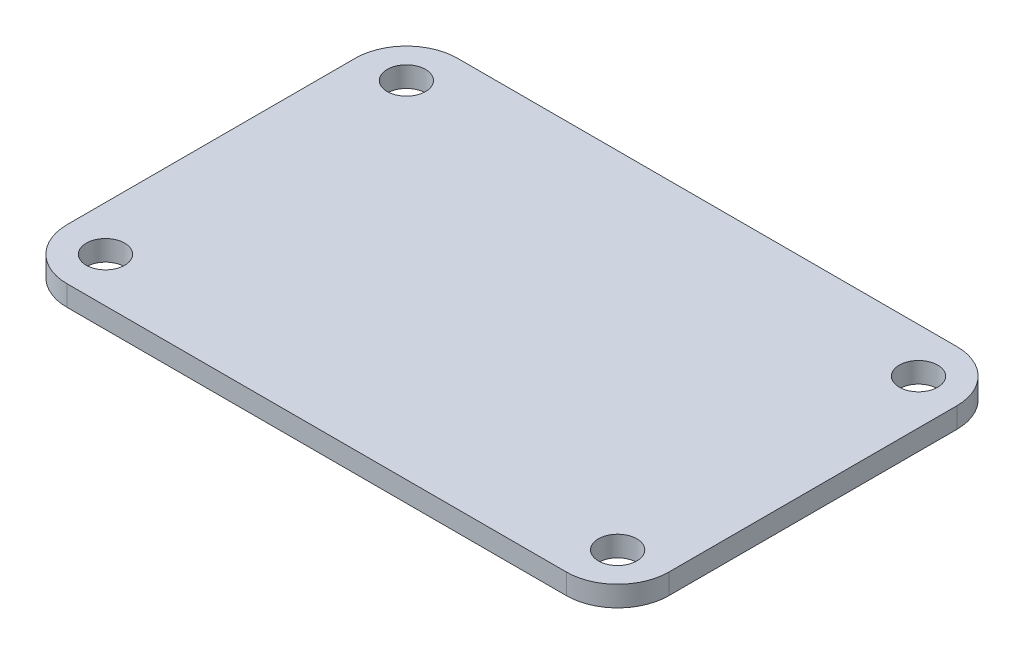
ISO-10303-21;
HEADER;
FILE_DESCRIPTION(('STEP AP214'),'2;1');
FILE_NAME('part.step','',(''),(''),'','','');
FILE_SCHEMA(('AUTOMOTIVE_DESIGN { 1 0 10303 214 1 1 1 1 }'));
ENDSEC;
DATA;
#1=APPLICATION_CONTEXT('core data for automotive mechanical design processes');
#2=APPLICATION_PROTOCOL_DEFINITION('international standard','automotive_design',2000,#1);
#3=PRODUCT_CONTEXT('',#1,'mechanical');
#4=PRODUCT('Part','Part','',(#3));
#5=PRODUCT_RELATED_PRODUCT_CATEGORY('part','',(#4));
#6=PRODUCT_DEFINITION_FORMATION('','',#4);
#7=PRODUCT_DEFINITION_CONTEXT('part definition',#1,'design');
#8=PRODUCT_DEFINITION('design','',#6,#7);
#9=PRODUCT_DEFINITION_SHAPE('','',#8);
#10=(LENGTH_UNIT() NAMED_UNIT(*) SI_UNIT(.MILLI.,.METRE.));
#11=(NAMED_UNIT(*) PLANE_ANGLE_UNIT() SI_UNIT($,.RADIAN.));
#12=(NAMED_UNIT(*) SI_UNIT($,.STERADIAN.) SOLID_ANGLE_UNIT());
#13=UNCERTAINTY_MEASURE_WITH_UNIT(LENGTH_MEASURE(1.E-05),#10,'distance_accuracy_value','');
#14=(GEOMETRIC_REPRESENTATION_CONTEXT(3) GLOBAL_UNCERTAINTY_ASSIGNED_CONTEXT((#13)) GLOBAL_UNIT_ASSIGNED_CONTEXT((#10,
#11,#12)) REPRESENTATION_CONTEXT('',''));
#15=CARTESIAN_POINT('',(0.,0.,0.));
#16=DIRECTION('',(0.,0.,1.));
#17=DIRECTION('',(1.,0.,0.));
#18=AXIS2_PLACEMENT_3D('',#15,#16,#17);
#19=CARTESIAN_POINT('',(-16.0006392577351,1.6,-12.1749296861175));
#20=DIRECTION('',(0.,-1.,0.));
#21=DIRECTION('',(0.,0.,-1.));
#22=AXIS2_PLACEMENT_3D('',#19,#20,#21);
#23=PLANE('',#22);
#24=CARTESIAN_POINT('',(-16.0006392577351,1.6,-12.1749296861175));
#25=DIRECTION('',(0.,1.,0.));
#26=DIRECTION('',(0.,0.,-1.));
#27=AXIS2_PLACEMENT_3D('',#24,#25,#26);
#28=CIRCLE('',#27,4.);
#29=CARTESIAN_POINT('',(-16.0006392577351,1.6,-16.1749296861175));
#30=VERTEX_POINT('',#29);
#31=CARTESIAN_POINT('',(-20.0006392577351,1.6,-12.1749296861175));
#32=VERTEX_POINT('',#31);
#33=EDGE_CURVE('E152',#30,#32,#28,.T.);
#34=ORIENTED_EDGE('',*,*,#33,.T.);
#35=DIRECTION('',(0.,0.,1.));
#36=VECTOR('',#35,1.);
#37=CARTESIAN_POINT('',(-20.0006392577351,1.6,-12.1749296861175));
#38=LINE('',#37,#36);
#39=CARTESIAN_POINT('',(-20.0006392577351,1.6,10.3250703138824));
#40=VERTEX_POINT('',#39);
#41=EDGE_CURVE('E100',#32,#40,#38,.T.);
#42=ORIENTED_EDGE('',*,*,#41,.T.);
#43=CARTESIAN_POINT('',(-16.0006392577351,1.6,10.3250703138825));
#44=DIRECTION('',(0.,1.,0.));
#45=DIRECTION('',(0.,0.,1.));
#46=AXIS2_PLACEMENT_3D('',#43,#44,#45);
#47=CIRCLE('',#46,4.);
#48=CARTESIAN_POINT('',(-16.0006392577351,1.6,14.3250703138825));
#49=VERTEX_POINT('',#48);
#50=EDGE_CURVE('E167',#40,#49,#47,.T.);
#51=ORIENTED_EDGE('',*,*,#50,.T.);
#52=DIRECTION('',(1.,0.,0.));
#53=VECTOR('',#52,1.);
#54=CARTESIAN_POINT('',(-16.0006392577351,1.6,14.3250703138824));
#55=LINE('',#54,#53);
#56=CARTESIAN_POINT('',(22.9993607422649,1.6,14.3250703138825));
#57=VERTEX_POINT('',#56);
#58=EDGE_CURVE('E180',#49,#57,#55,.T.);
#59=ORIENTED_EDGE('',*,*,#58,.T.);
#60=CARTESIAN_POINT('',(22.9993607422649,1.6,10.3250703138825));
#61=DIRECTION('',(0.,1.,0.));
#62=DIRECTION('',(0.,0.,1.));
#63=AXIS2_PLACEMENT_3D('',#60,#61,#62);
#64=CIRCLE('',#63,4.);
#65=CARTESIAN_POINT('',(26.9993607422649,1.6,10.3250703138825));
#66=VERTEX_POINT('',#65);
#67=EDGE_CURVE('E119',#57,#66,#64,.T.);
#68=ORIENTED_EDGE('',*,*,#67,.T.);
#69=DIRECTION('',(0.,0.,-1.));
#70=VECTOR('',#69,1.);
#71=CARTESIAN_POINT('',(26.9993607422649,1.6,-12.1749296861175));
#72=LINE('',#71,#70);
#73=CARTESIAN_POINT('',(26.9993607422649,1.6,-12.1749296861175));
#74=VERTEX_POINT('',#73);
#75=EDGE_CURVE('E113',#66,#74,#72,.T.);
#76=ORIENTED_EDGE('',*,*,#75,.T.);
#77=CARTESIAN_POINT('',(22.9993607422649,1.6,-12.1749296861175));
#78=DIRECTION('',(0.,1.,0.));
#79=DIRECTION('',(0.,0.,1.));
#80=AXIS2_PLACEMENT_3D('',#77,#78,#79);
#81=CIRCLE('',#80,4.);
#82=CARTESIAN_POINT('',(22.9993607422649,1.6,-16.1749296861175));
#83=VERTEX_POINT('',#82);
#84=EDGE_CURVE('E117',#74,#83,#81,.T.);
#85=ORIENTED_EDGE('',*,*,#84,.T.);
#86=DIRECTION('',(-1.,0.,0.));
#87=VECTOR('',#86,1.);
#88=CARTESIAN_POINT('',(-16.0006392577351,1.6,-16.1749296861175));
#89=LINE('',#88,#87);
#90=EDGE_CURVE('E57',#83,#30,#89,.T.);
#91=ORIENTED_EDGE('',*,*,#90,.T.);
#92=EDGE_LOOP('',(#34,#42,#51,#59,#68,#76,#85,#91));
#93=FACE_BOUND('',#92,.T.);
#94=CARTESIAN_POINT('',(-16.5006392577351,1.6,-12.6749296861175));
#95=DIRECTION('',(0.,1.,0.));
#96=DIRECTION('',(0.,0.,1.));
#97=AXIS2_PLACEMENT_3D('',#94,#95,#96);
#98=CIRCLE('',#97,1.5);
#99=CARTESIAN_POINT('',(-16.5006392577351,1.6,-11.1749296861175));
#100=VERTEX_POINT('',#99);
#101=EDGE_CURVE('E141',#100,#100,#98,.T.);
#102=ORIENTED_EDGE('',*,*,#101,.F.);
#103=EDGE_LOOP('',(#102));
#104=FACE_BOUND('',#103,.T.);
#105=CARTESIAN_POINT('',(23.4993607422649,1.6,-12.6749296861175));
#106=DIRECTION('',(0.,1.,0.));
#107=DIRECTION('',(0.,0.,1.));
#108=AXIS2_PLACEMENT_3D('',#105,#106,#107);
#109=CIRCLE('',#108,1.5);
#110=CARTESIAN_POINT('',(23.4993607422649,1.6,-11.1749296861175));
#111=VERTEX_POINT('',#110);
#112=EDGE_CURVE('E189',#111,#111,#109,.T.);
#113=ORIENTED_EDGE('',*,*,#112,.F.);
#114=EDGE_LOOP('',(#113));
#115=FACE_BOUND('',#114,.T.);
#116=CARTESIAN_POINT('',(-16.5006392577351,1.6,10.8250703138825));
#117=DIRECTION('',(0.,1.,0.));
#118=DIRECTION('',(0.,0.,1.));
#119=AXIS2_PLACEMENT_3D('',#116,#117,#118);
#120=CIRCLE('',#119,1.5);
#121=CARTESIAN_POINT('',(-16.5006392577351,1.6,12.3250703138825));
#122=VERTEX_POINT('',#121);
#123=EDGE_CURVE('E195',#122,#122,#120,.T.);
#124=ORIENTED_EDGE('',*,*,#123,.F.);
#125=EDGE_LOOP('',(#124));
#126=FACE_BOUND('',#125,.T.);
#127=CARTESIAN_POINT('',(23.4993607422649,1.6,10.8250703138825));
#128=DIRECTION('',(0.,1.,0.));
#129=DIRECTION('',(0.,0.,1.));
#130=AXIS2_PLACEMENT_3D('',#127,#128,#129);
#131=CIRCLE('',#130,1.5);
#132=CARTESIAN_POINT('',(23.4993607422649,1.6,12.3250703138825));
#133=VERTEX_POINT('',#132);
#134=EDGE_CURVE('E201',#133,#133,#131,.T.);
#135=ORIENTED_EDGE('',*,*,#134,.F.);
#136=EDGE_LOOP('',(#135));
#137=FACE_BOUND('',#136,.T.);
#138=ADVANCED_FACE('F40',(#93,#104,#115,#126,#137),#23,.F.);
#139=CARTESIAN_POINT('',(-16.0006392577351,0.,-12.1749296861175));
#140=DIRECTION('',(0.,-1.,0.));
#141=DIRECTION('',(0.,0.,-1.));
#142=AXIS2_PLACEMENT_3D('',#139,#140,#141);
#143=PLANE('',#142);
#144=CARTESIAN_POINT('',(-16.5006392577351,0.,10.8250703138825));
#145=DIRECTION('',(0.,1.,0.));
#146=DIRECTION('',(0.,0.,1.));
#147=AXIS2_PLACEMENT_3D('',#144,#145,#146);
#148=CIRCLE('',#147,1.5);
#149=CARTESIAN_POINT('',(-16.5006392577351,0.,12.3250703138825));
#150=VERTEX_POINT('',#149);
#151=EDGE_CURVE('E198',#150,#150,#148,.T.);
#152=ORIENTED_EDGE('',*,*,#151,.T.);
#153=EDGE_LOOP('',(#152));
#154=FACE_BOUND('',#153,.T.);
#155=CARTESIAN_POINT('',(-16.5006392577351,0.,-12.6749296861175));
#156=DIRECTION('',(0.,1.,0.));
#157=DIRECTION('',(0.,0.,1.));
#158=AXIS2_PLACEMENT_3D('',#155,#156,#157);
#159=CIRCLE('',#158,1.5);
#160=CARTESIAN_POINT('',(-16.5006392577351,0.,-11.1749296861175));
#161=VERTEX_POINT('',#160);
#162=EDGE_CURVE('E186',#161,#161,#159,.T.);
#163=ORIENTED_EDGE('',*,*,#162,.T.);
#164=EDGE_LOOP('',(#163));
#165=FACE_BOUND('',#164,.T.);
#166=CARTESIAN_POINT('',(-16.0006392577351,0.,-12.1749296861175));
#167=DIRECTION('',(0.,1.,0.));
#168=DIRECTION('',(0.,0.,-1.));
#169=AXIS2_PLACEMENT_3D('',#166,#167,#168);
#170=CIRCLE('',#169,4.);
#171=CARTESIAN_POINT('',(-16.0006392577351,0.,-16.1749296861175));
#172=VERTEX_POINT('',#171);
#173=CARTESIAN_POINT('',(-20.0006392577351,0.,-12.1749296861175));
#174=VERTEX_POINT('',#173);
#175=EDGE_CURVE('E137',#172,#174,#170,.T.);
#176=ORIENTED_EDGE('',*,*,#175,.F.);
#177=DIRECTION('',(-1.,0.,0.));
#178=VECTOR('',#177,1.);
#179=CARTESIAN_POINT('',(-16.0006392577351,0.,-16.1749296861175));
#180=LINE('',#179,#178);
#181=CARTESIAN_POINT('',(22.9993607422649,0.,-16.1749296861175));
#182=VERTEX_POINT('',#181);
#183=EDGE_CURVE('E92',#182,#172,#180,.T.);
#184=ORIENTED_EDGE('',*,*,#183,.F.);
#185=CARTESIAN_POINT('',(22.9993607422649,0.,-12.1749296861175));
#186=DIRECTION('',(0.,1.,0.));
#187=DIRECTION('',(0.,0.,1.));
#188=AXIS2_PLACEMENT_3D('',#185,#186,#187);
#189=CIRCLE('',#188,4.);
#190=CARTESIAN_POINT('',(26.9993607422649,0.,-12.1749296861175));
#191=VERTEX_POINT('',#190);
#192=EDGE_CURVE('E86',#191,#182,#189,.T.);
#193=ORIENTED_EDGE('',*,*,#192,.F.);
#194=DIRECTION('',(0.,0.,-1.));
#195=VECTOR('',#194,1.);
#196=CARTESIAN_POINT('',(26.9993607422649,0.,-12.1749296861175));
#197=LINE('',#196,#195);
#198=CARTESIAN_POINT('',(26.9993607422649,0.,10.3250703138825));
#199=VERTEX_POINT('',#198);
#200=EDGE_CURVE('E127',#199,#191,#197,.T.);
#201=ORIENTED_EDGE('',*,*,#200,.F.);
#202=CARTESIAN_POINT('',(22.9993607422649,0.,10.3250703138825));
#203=DIRECTION('',(0.,1.,0.));
#204=DIRECTION('',(0.,0.,1.));
#205=AXIS2_PLACEMENT_3D('',#202,#203,#204);
#206=CIRCLE('',#205,4.);
#207=CARTESIAN_POINT('',(22.9993607422649,0.,14.3250703138825));
#208=VERTEX_POINT('',#207);
#209=EDGE_CURVE('E147',#208,#199,#206,.T.);
#210=ORIENTED_EDGE('',*,*,#209,.F.);
#211=DIRECTION('',(1.,0.,0.));
#212=VECTOR('',#211,1.);
#213=CARTESIAN_POINT('',(-16.0006392577351,0.,14.3250703138824));
#214=LINE('',#213,#212);
#215=CARTESIAN_POINT('',(-16.0006392577351,0.,14.3250703138825));
#216=VERTEX_POINT('',#215);
#217=EDGE_CURVE('E145',#216,#208,#214,.T.);
#218=ORIENTED_EDGE('',*,*,#217,.F.);
#219=CARTESIAN_POINT('',(-16.0006392577351,0.,10.3250703138825));
#220=DIRECTION('',(0.,1.,0.));
#221=DIRECTION('',(0.,0.,1.));
#222=AXIS2_PLACEMENT_3D('',#219,#220,#221);
#223=CIRCLE('',#222,4.);
#224=CARTESIAN_POINT('',(-20.0006392577351,0.,10.3250703138824));
#225=VERTEX_POINT('',#224);
#226=EDGE_CURVE('E143',#225,#216,#223,.T.);
#227=ORIENTED_EDGE('',*,*,#226,.F.);
#228=DIRECTION('',(0.,0.,1.));
#229=VECTOR('',#228,1.);
#230=CARTESIAN_POINT('',(-20.0006392577351,0.,-12.1749296861175));
#231=LINE('',#230,#229);
#232=EDGE_CURVE('E140',#174,#225,#231,.T.);
#233=ORIENTED_EDGE('',*,*,#232,.F.);
#234=EDGE_LOOP('',(#176,#184,#193,#201,#210,#218,#227,#233));
#235=FACE_BOUND('',#234,.T.);
#236=CARTESIAN_POINT('',(23.4993607422649,0.,-12.6749296861175));
#237=DIRECTION('',(0.,1.,0.));
#238=DIRECTION('',(0.,0.,1.));
#239=AXIS2_PLACEMENT_3D('',#236,#237,#238);
#240=CIRCLE('',#239,1.5);
#241=CARTESIAN_POINT('',(23.4993607422649,0.,-11.1749296861175));
#242=VERTEX_POINT('',#241);
#243=EDGE_CURVE('E192',#242,#242,#240,.T.);
#244=ORIENTED_EDGE('',*,*,#243,.T.);
#245=EDGE_LOOP('',(#244));
#246=FACE_BOUND('',#245,.T.);
#247=CARTESIAN_POINT('',(23.4993607422649,0.,10.8250703138825));
#248=DIRECTION('',(0.,1.,0.));
#249=DIRECTION('',(0.,0.,1.));
#250=AXIS2_PLACEMENT_3D('',#247,#248,#249);
#251=CIRCLE('',#250,1.5);
#252=CARTESIAN_POINT('',(23.4993607422649,0.,12.3250703138825));
#253=VERTEX_POINT('',#252);
#254=EDGE_CURVE('E204',#253,#253,#251,.T.);
#255=ORIENTED_EDGE('',*,*,#254,.T.);
#256=EDGE_LOOP('',(#255));
#257=FACE_BOUND('',#256,.T.);
#258=ADVANCED_FACE('F171',(#154,#165,#235,#246,#257),#143,.T.);
#259=CARTESIAN_POINT('',(-16.0006392577351,1.6,-12.1749296861175));
#260=DIRECTION('',(0.,-1.,0.));
#261=DIRECTION('',(0.,0.,-1.));
#262=AXIS2_PLACEMENT_3D('',#259,#260,#261);
#263=CYLINDRICAL_SURFACE('',#262,4.);
#264=ORIENTED_EDGE('',*,*,#175,.T.);
#265=DIRECTION('',(0.,-1.,0.));
#266=VECTOR('',#265,1.);
#267=CARTESIAN_POINT('',(-20.0006392577351,1.6,-12.1749296861175));
#268=LINE('',#267,#266);
#269=EDGE_CURVE('E11',#32,#174,#268,.T.);
#270=ORIENTED_EDGE('',*,*,#269,.F.);
#271=ORIENTED_EDGE('',*,*,#33,.F.);
#272=DIRECTION('',(0.,-1.,0.));
#273=VECTOR('',#272,1.);
#274=CARTESIAN_POINT('',(-16.0006392577351,1.6,-16.1749296861175));
#275=LINE('',#274,#273);
#276=EDGE_CURVE('E133',#30,#172,#275,.T.);
#277=ORIENTED_EDGE('',*,*,#276,.T.);
#278=EDGE_LOOP('',(#264,#270,#271,#277));
#279=FACE_BOUND('',#278,.T.);
#280=ADVANCED_FACE('F42',(#279),#263,.T.);
#281=CARTESIAN_POINT('',(-20.0006392577351,1.6,-12.1749296861175));
#282=DIRECTION('',(1.,0.,0.));
#283=DIRECTION('',(0.,0.,-1.));
#284=AXIS2_PLACEMENT_3D('',#281,#282,#283);
#285=PLANE('',#284);
#286=ORIENTED_EDGE('',*,*,#232,.T.);
#287=DIRECTION('',(0.,-1.,0.));
#288=VECTOR('',#287,1.);
#289=CARTESIAN_POINT('',(-20.0006392577351,1.6,10.3250703138824));
#290=LINE('',#289,#288);
#291=EDGE_CURVE('E49',#40,#225,#290,.T.);
#292=ORIENTED_EDGE('',*,*,#291,.F.);
#293=ORIENTED_EDGE('',*,*,#41,.F.);
#294=ORIENTED_EDGE('',*,*,#269,.T.);
#295=EDGE_LOOP('',(#286,#292,#293,#294));
#296=FACE_BOUND('',#295,.T.);
#297=ADVANCED_FACE('F236',(#296),#285,.F.);
#298=CARTESIAN_POINT('',(-16.0006392577351,1.6,10.3250703138825));
#299=DIRECTION('',(0.,-1.,0.));
#300=DIRECTION('',(0.,0.,-1.));
#301=AXIS2_PLACEMENT_3D('',#298,#299,#300);
#302=CYLINDRICAL_SURFACE('',#301,4.);
#303=ORIENTED_EDGE('',*,*,#226,.T.);
#304=DIRECTION('',(0.,-1.,0.));
#305=VECTOR('',#304,1.);
#306=CARTESIAN_POINT('',(-16.0006392577351,1.6,14.3250703138825));
#307=LINE('',#306,#305);
#308=EDGE_CURVE('E159',#49,#216,#307,.T.);
#309=ORIENTED_EDGE('',*,*,#308,.F.);
#310=ORIENTED_EDGE('',*,*,#50,.F.);
#311=ORIENTED_EDGE('',*,*,#291,.T.);
#312=EDGE_LOOP('',(#303,#309,#310,#311));
#313=FACE_BOUND('',#312,.T.);
#314=ADVANCED_FACE('F165',(#313),#302,.T.);
#315=CARTESIAN_POINT('',(-16.0006392577351,1.6,14.3250703138824));
#316=DIRECTION('',(0.,0.,-1.));
#317=DIRECTION('',(-1.,0.,0.));
#318=AXIS2_PLACEMENT_3D('',#315,#316,#317);
#319=PLANE('',#318);
#320=ORIENTED_EDGE('',*,*,#217,.T.);
#321=DIRECTION('',(0.,-1.,0.));
#322=VECTOR('',#321,1.);
#323=CARTESIAN_POINT('',(22.9993607422649,1.6,14.3250703138825));
#324=LINE('',#323,#322);
#325=EDGE_CURVE('E156',#57,#208,#324,.T.);
#326=ORIENTED_EDGE('',*,*,#325,.F.);
#327=ORIENTED_EDGE('',*,*,#58,.F.);
#328=ORIENTED_EDGE('',*,*,#308,.T.);
#329=EDGE_LOOP('',(#320,#326,#327,#328));
#330=FACE_BOUND('',#329,.T.);
#331=ADVANCED_FACE('F176',(#330),#319,.F.);
#332=CARTESIAN_POINT('',(22.9993607422649,1.6,10.3250703138825));
#333=DIRECTION('',(0.,-1.,0.));
#334=DIRECTION('',(0.,0.,-1.));
#335=AXIS2_PLACEMENT_3D('',#332,#333,#334);
#336=CYLINDRICAL_SURFACE('',#335,4.);
#337=ORIENTED_EDGE('',*,*,#209,.T.);
#338=DIRECTION('',(0.,-1.,0.));
#339=VECTOR('',#338,1.);
#340=CARTESIAN_POINT('',(26.9993607422649,1.6,10.3250703138825));
#341=LINE('',#340,#339);
#342=EDGE_CURVE('E128',#66,#199,#341,.T.);
#343=ORIENTED_EDGE('',*,*,#342,.F.);
#344=ORIENTED_EDGE('',*,*,#67,.F.);
#345=ORIENTED_EDGE('',*,*,#325,.T.);
#346=EDGE_LOOP('',(#337,#343,#344,#345));
#347=FACE_BOUND('',#346,.T.);
#348=ADVANCED_FACE('F179',(#347),#336,.T.);
#349=CARTESIAN_POINT('',(26.9993607422649,1.6,-12.1749296861175));
#350=DIRECTION('',(-1.,0.,0.));
#351=DIRECTION('',(0.,0.,1.));
#352=AXIS2_PLACEMENT_3D('',#349,#350,#351);
#353=PLANE('',#352);
#354=ORIENTED_EDGE('',*,*,#200,.T.);
#355=DIRECTION('',(0.,-1.,0.));
#356=VECTOR('',#355,1.);
#357=CARTESIAN_POINT('',(26.9993607422649,1.6,-12.1749296861175));
#358=LINE('',#357,#356);
#359=EDGE_CURVE('E124',#74,#191,#358,.T.);
#360=ORIENTED_EDGE('',*,*,#359,.F.);
#361=ORIENTED_EDGE('',*,*,#75,.F.);
#362=ORIENTED_EDGE('',*,*,#342,.T.);
#363=EDGE_LOOP('',(#354,#360,#361,#362));
#364=FACE_BOUND('',#363,.T.);
#365=ADVANCED_FACE('F125',(#364),#353,.F.);
#366=CARTESIAN_POINT('',(22.9993607422649,1.6,-12.1749296861175));
#367=DIRECTION('',(0.,-1.,0.));
#368=DIRECTION('',(0.,0.,-1.));
#369=AXIS2_PLACEMENT_3D('',#366,#367,#368);
#370=CYLINDRICAL_SURFACE('',#369,4.);
#371=ORIENTED_EDGE('',*,*,#192,.T.);
#372=DIRECTION('',(0.,-1.,0.));
#373=VECTOR('',#372,1.);
#374=CARTESIAN_POINT('',(22.9993607422649,1.6,-16.1749296861175));
#375=LINE('',#374,#373);
#376=EDGE_CURVE('E129',#83,#182,#375,.T.);
#377=ORIENTED_EDGE('',*,*,#376,.F.);
#378=ORIENTED_EDGE('',*,*,#84,.F.);
#379=ORIENTED_EDGE('',*,*,#359,.T.);
#380=EDGE_LOOP('',(#371,#377,#378,#379));
#381=FACE_BOUND('',#380,.T.);
#382=ADVANCED_FACE('F131',(#381),#370,.T.);
#383=CARTESIAN_POINT('',(-16.0006392577351,1.6,-16.1749296861175));
#384=DIRECTION('',(0.,0.,1.));
#385=DIRECTION('',(1.,0.,0.));
#386=AXIS2_PLACEMENT_3D('',#383,#384,#385);
#387=PLANE('',#386);
#388=ORIENTED_EDGE('',*,*,#183,.T.);
#389=ORIENTED_EDGE('',*,*,#276,.F.);
#390=ORIENTED_EDGE('',*,*,#90,.F.);
#391=ORIENTED_EDGE('',*,*,#376,.T.);
#392=EDGE_LOOP('',(#388,#389,#390,#391));
#393=FACE_BOUND('',#392,.T.);
#394=ADVANCED_FACE('F224',(#393),#387,.F.);
#395=CARTESIAN_POINT('',(-16.5006392577351,1.6,-12.6749296861175));
#396=DIRECTION('',(0.,-1.,0.));
#397=DIRECTION('',(0.,0.,-1.));
#398=AXIS2_PLACEMENT_3D('',#395,#396,#397);
#399=CYLINDRICAL_SURFACE('',#398,1.5);
#400=ORIENTED_EDGE('',*,*,#101,.T.);
#401=EDGE_LOOP('',(#400));
#402=FACE_BOUND('',#401,.T.);
#403=ORIENTED_EDGE('',*,*,#162,.F.);
#404=EDGE_LOOP('',(#403));
#405=FACE_BOUND('',#404,.T.);
#406=ADVANCED_FACE('F221',(#402,#405),#399,.F.);
#407=CARTESIAN_POINT('',(23.4993607422649,1.6,-12.6749296861175));
#408=DIRECTION('',(0.,-1.,0.));
#409=DIRECTION('',(0.,0.,-1.));
#410=AXIS2_PLACEMENT_3D('',#407,#408,#409);
#411=CYLINDRICAL_SURFACE('',#410,1.5);
#412=ORIENTED_EDGE('',*,*,#112,.T.);
#413=EDGE_LOOP('',(#412));
#414=FACE_BOUND('',#413,.T.);
#415=ORIENTED_EDGE('',*,*,#243,.F.);
#416=EDGE_LOOP('',(#415));
#417=FACE_BOUND('',#416,.T.);
#418=ADVANCED_FACE('F312',(#414,#417),#411,.F.);
#419=CARTESIAN_POINT('',(-16.5006392577351,1.6,10.8250703138825));
#420=DIRECTION('',(0.,-1.,0.));
#421=DIRECTION('',(0.,0.,-1.));
#422=AXIS2_PLACEMENT_3D('',#419,#420,#421);
#423=CYLINDRICAL_SURFACE('',#422,1.5);
#424=ORIENTED_EDGE('',*,*,#123,.T.);
#425=EDGE_LOOP('',(#424));
#426=FACE_BOUND('',#425,.T.);
#427=ORIENTED_EDGE('',*,*,#151,.F.);
#428=EDGE_LOOP('',(#427));
#429=FACE_BOUND('',#428,.T.);
#430=ADVANCED_FACE('F321',(#426,#429),#423,.F.);
#431=CARTESIAN_POINT('',(23.4993607422649,1.6,10.8250703138825));
#432=DIRECTION('',(0.,-1.,0.));
#433=DIRECTION('',(0.,0.,-1.));
#434=AXIS2_PLACEMENT_3D('',#431,#432,#433);
#435=CYLINDRICAL_SURFACE('',#434,1.5);
#436=ORIENTED_EDGE('',*,*,#134,.T.);
#437=EDGE_LOOP('',(#436));
#438=FACE_BOUND('',#437,.T.);
#439=ORIENTED_EDGE('',*,*,#254,.F.);
#440=EDGE_LOOP('',(#439));
#441=FACE_BOUND('',#440,.T.);
#442=ADVANCED_FACE('F210',(#438,#441),#435,.F.);
#443=CLOSED_SHELL('',(#138,#258,#280,#297,#314,#331,#348,#365,#382,#394,#406,#418,#430,#442));
#444=MANIFOLD_SOLID_BREP('B2',#443);
#445=ADVANCED_BREP_SHAPE_REPRESENTATION('',(#18,#444),#14);
#446=SHAPE_DEFINITION_REPRESENTATION(#9,#445);
ENDSEC;
END-ISO-10303-21;
